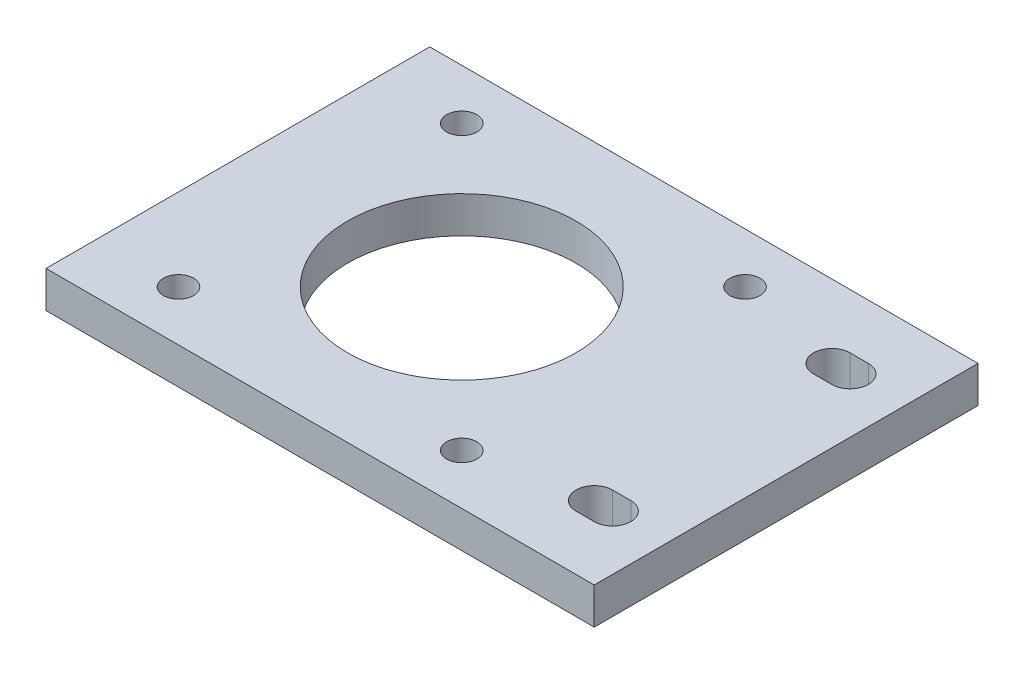
ISO-10303-21;
HEADER;
FILE_DESCRIPTION(('STEP AP214'),'2;1');
FILE_NAME('part.step','',(''),(''),'','','');
FILE_SCHEMA(('AUTOMOTIVE_DESIGN { 1 0 10303 214 1 1 1 1 }'));
ENDSEC;
DATA;
#1=APPLICATION_CONTEXT('core data for automotive mechanical design processes');
#2=APPLICATION_PROTOCOL_DEFINITION('international standard','automotive_design',2000,#1);
#3=PRODUCT_CONTEXT('',#1,'mechanical');
#4=PRODUCT('Part','Part','',(#3));
#5=PRODUCT_RELATED_PRODUCT_CATEGORY('part','',(#4));
#6=PRODUCT_DEFINITION_FORMATION('','',#4);
#7=PRODUCT_DEFINITION_CONTEXT('part definition',#1,'design');
#8=PRODUCT_DEFINITION('design','',#6,#7);
#9=PRODUCT_DEFINITION_SHAPE('','',#8);
#10=(LENGTH_UNIT() NAMED_UNIT(*) SI_UNIT(.MILLI.,.METRE.));
#11=(NAMED_UNIT(*) PLANE_ANGLE_UNIT() SI_UNIT($,.RADIAN.));
#12=(NAMED_UNIT(*) SI_UNIT($,.STERADIAN.) SOLID_ANGLE_UNIT());
#13=UNCERTAINTY_MEASURE_WITH_UNIT(LENGTH_MEASURE(1.E-05),#10,'distance_accuracy_value','');
#14=(GEOMETRIC_REPRESENTATION_CONTEXT(3) GLOBAL_UNCERTAINTY_ASSIGNED_CONTEXT((#13)) GLOBAL_UNIT_ASSIGNED_CONTEXT((#10,
#11,#12)) REPRESENTATION_CONTEXT('',''));
#15=CARTESIAN_POINT('',(0.,0.,0.));
#16=DIRECTION('',(0.,0.,1.));
#17=DIRECTION('',(1.,0.,0.));
#18=AXIS2_PLACEMENT_3D('',#15,#16,#17);
#19=CARTESIAN_POINT('',(0.,4.,0.));
#20=DIRECTION('',(0.,1.,0.));
#21=DIRECTION('',(0.,0.,1.));
#22=AXIS2_PLACEMENT_3D('',#19,#20,#21);
#23=PLANE('',#22);
#24=CARTESIAN_POINT('',(2.24787364877131,4.,32.6029842915746));
#25=DIRECTION('',(0.,1.,0.));
#26=DIRECTION('',(0.,0.,1.));
#27=AXIS2_PLACEMENT_3D('',#24,#25,#26);
#28=CIRCLE('',#27,1.65);
#29=CARTESIAN_POINT('',(2.24787364877131,4.,34.2529842915746));
#30=VERTEX_POINT('',#29);
#31=EDGE_CURVE('E377',#30,#30,#28,.T.);
#32=ORIENTED_EDGE('',*,*,#31,.F.);
#33=EDGE_LOOP('',(#32));
#34=FACE_BOUND('',#33,.T.);
#35=CARTESIAN_POINT('',(2.24787364877131,4.,1.60298429157464));
#36=DIRECTION('',(0.,1.,0.));
#37=DIRECTION('',(0.,0.,1.));
#38=AXIS2_PLACEMENT_3D('',#35,#36,#37);
#39=CIRCLE('',#38,1.65);
#40=CARTESIAN_POINT('',(2.24787364877131,4.,3.25298429157464));
#41=VERTEX_POINT('',#40);
#42=EDGE_CURVE('E393',#41,#41,#39,.T.);
#43=ORIENTED_EDGE('',*,*,#42,.F.);
#44=EDGE_LOOP('',(#43));
#45=FACE_BOUND('',#44,.T.);
#46=DIRECTION('',(1.,0.,0.));
#47=VECTOR('',#46,1.);
#48=CARTESIAN_POINT('',(45.2478736487713,4.,32.1029842915746));
#49=LINE('',#48,#47);
#50=CARTESIAN_POINT('',(45.2478736487713,4.,32.1029842915746));
#51=VERTEX_POINT('',#50);
#52=CARTESIAN_POINT('',(47.2478736487713,4.,32.1029842915746));
#53=VERTEX_POINT('',#52);
#54=EDGE_CURVE('E140',#51,#53,#49,.T.);
#55=ORIENTED_EDGE('',*,*,#54,.F.);
#56=CARTESIAN_POINT('',(45.2478736487713,4.,30.1029842915746));
#57=DIRECTION('',(0.,1.,0.));
#58=DIRECTION('',(0.,0.,-1.));
#59=AXIS2_PLACEMENT_3D('',#56,#57,#58);
#60=CIRCLE('',#59,2.);
#61=CARTESIAN_POINT('',(45.2478736487713,4.,28.1029842915746));
#62=VERTEX_POINT('',#61);
#63=EDGE_CURVE('E131',#62,#51,#60,.T.);
#64=ORIENTED_EDGE('',*,*,#63,.F.);
#65=DIRECTION('',(-1.,0.,0.));
#66=VECTOR('',#65,1.);
#67=CARTESIAN_POINT('',(45.2478736487713,4.,28.1029842915746));
#68=LINE('',#67,#66);
#69=CARTESIAN_POINT('',(47.2478736487713,4.,28.1029842915746));
#70=VERTEX_POINT('',#69);
#71=EDGE_CURVE('E158',#70,#62,#68,.T.);
#72=ORIENTED_EDGE('',*,*,#71,.F.);
#73=CARTESIAN_POINT('',(47.2478736487713,4.,30.1029842915746));
#74=DIRECTION('',(0.,1.,0.));
#75=DIRECTION('',(0.,0.,-1.));
#76=AXIS2_PLACEMENT_3D('',#73,#74,#75);
#77=CIRCLE('',#76,2.);
#78=EDGE_CURVE('E154',#53,#70,#77,.T.);
#79=ORIENTED_EDGE('',*,*,#78,.F.);
#80=EDGE_LOOP('',(#55,#64,#72,#79));
#81=FACE_BOUND('',#80,.T.);
#82=DIRECTION('',(1.,0.,0.));
#83=VECTOR('',#82,1.);
#84=CARTESIAN_POINT('',(45.2478736487713,4.,6.10298429157464));
#85=LINE('',#84,#83);
#86=CARTESIAN_POINT('',(45.2478736487713,4.,6.10298429157464));
#87=VERTEX_POINT('',#86);
#88=CARTESIAN_POINT('',(47.2478736487713,4.,6.10298429157464));
#89=VERTEX_POINT('',#88);
#90=EDGE_CURVE('E185',#87,#89,#85,.T.);
#91=ORIENTED_EDGE('',*,*,#90,.F.);
#92=CARTESIAN_POINT('',(45.2478736487713,4.,4.10298429157464));
#93=DIRECTION('',(0.,1.,0.));
#94=DIRECTION('',(0.,0.,1.));
#95=AXIS2_PLACEMENT_3D('',#92,#93,#94);
#96=CIRCLE('',#95,2.);
#97=CARTESIAN_POINT('',(45.2478736487713,4.,2.10298429157464));
#98=VERTEX_POINT('',#97);
#99=EDGE_CURVE('E182',#98,#87,#96,.T.);
#100=ORIENTED_EDGE('',*,*,#99,.F.);
#101=DIRECTION('',(-1.,0.,0.));
#102=VECTOR('',#101,1.);
#103=CARTESIAN_POINT('',(45.2478736487713,4.,2.10298429157464));
#104=LINE('',#103,#102);
#105=CARTESIAN_POINT('',(47.2478736487713,4.,2.10298429157464));
#106=VERTEX_POINT('',#105);
#107=EDGE_CURVE('E193',#106,#98,#104,.T.);
#108=ORIENTED_EDGE('',*,*,#107,.F.);
#109=CARTESIAN_POINT('',(47.2478736487713,4.,4.10298429157464));
#110=DIRECTION('',(0.,1.,0.));
#111=DIRECTION('',(0.,0.,1.));
#112=AXIS2_PLACEMENT_3D('',#109,#110,#111);
#113=CIRCLE('',#112,2.);
#114=EDGE_CURVE('E189',#89,#106,#113,.T.);
#115=ORIENTED_EDGE('',*,*,#114,.F.);
#116=EDGE_LOOP('',(#91,#100,#108,#115));
#117=FACE_BOUND('',#116,.T.);
#118=DIRECTION('',(0.,0.,1.));
#119=VECTOR('',#118,1.);
#120=CARTESIAN_POINT('',(-6.75212635122869,4.,-3.89701570842536));
#121=LINE('',#120,#119);
#122=CARTESIAN_POINT('',(-6.75212635122869,4.,-3.89701570842536));
#123=VERTEX_POINT('',#122);
#124=CARTESIAN_POINT('',(-6.75212635122869,4.,38.1029842915746));
#125=VERTEX_POINT('',#124);
#126=EDGE_CURVE('E225',#123,#125,#121,.T.);
#127=ORIENTED_EDGE('',*,*,#126,.T.);
#128=DIRECTION('',(1.,0.,0.));
#129=VECTOR('',#128,1.);
#130=CARTESIAN_POINT('',(-6.75212635122869,4.,38.1029842915746));
#131=LINE('',#130,#129);
#132=CARTESIAN_POINT('',(53.2478736487713,4.,38.1029842915746));
#133=VERTEX_POINT('',#132);
#134=EDGE_CURVE('E229',#125,#133,#131,.T.);
#135=ORIENTED_EDGE('',*,*,#134,.T.);
#136=DIRECTION('',(0.,0.,-1.));
#137=VECTOR('',#136,1.);
#138=CARTESIAN_POINT('',(53.2478736487713,4.,-3.89701570842536));
#139=LINE('',#138,#137);
#140=CARTESIAN_POINT('',(53.2478736487713,4.,-3.89701570842536));
#141=VERTEX_POINT('',#140);
#142=EDGE_CURVE('E233',#133,#141,#139,.T.);
#143=ORIENTED_EDGE('',*,*,#142,.T.);
#144=DIRECTION('',(-1.,0.,0.));
#145=VECTOR('',#144,1.);
#146=CARTESIAN_POINT('',(-6.75212635122869,4.,-3.89701570842536));
#147=LINE('',#146,#145);
#148=EDGE_CURVE('E236',#141,#123,#147,.T.);
#149=ORIENTED_EDGE('',*,*,#148,.T.);
#150=EDGE_LOOP('',(#127,#135,#143,#149));
#151=FACE_BOUND('',#150,.T.);
#152=CARTESIAN_POINT('',(33.2478736487713,4.,1.60298429157464));
#153=DIRECTION('',(0.,1.,0.));
#154=DIRECTION('',(0.,0.,1.));
#155=AXIS2_PLACEMENT_3D('',#152,#153,#154);
#156=CIRCLE('',#155,1.65);
#157=CARTESIAN_POINT('',(33.2478736487713,4.,3.25298429157464));
#158=VERTEX_POINT('',#157);
#159=EDGE_CURVE('E166',#158,#158,#156,.T.);
#160=ORIENTED_EDGE('',*,*,#159,.F.);
#161=EDGE_LOOP('',(#160));
#162=FACE_BOUND('',#161,.T.);
#163=CARTESIAN_POINT('',(33.2478736487713,4.,32.6029842915746));
#164=DIRECTION('',(0.,1.,0.));
#165=DIRECTION('',(0.,0.,1.));
#166=AXIS2_PLACEMENT_3D('',#163,#164,#165);
#167=CIRCLE('',#166,1.65);
#168=CARTESIAN_POINT('',(33.2478736487713,4.,34.2529842915746));
#169=VERTEX_POINT('',#168);
#170=EDGE_CURVE('E385',#169,#169,#167,.T.);
#171=ORIENTED_EDGE('',*,*,#170,.F.);
#172=EDGE_LOOP('',(#171));
#173=FACE_BOUND('',#172,.T.);
#174=CARTESIAN_POINT('',(17.7478736487713,4.,17.1029842915746));
#175=DIRECTION('',(0.,1.,0.));
#176=DIRECTION('',(0.,0.,1.));
#177=AXIS2_PLACEMENT_3D('',#174,#175,#176);
#178=CIRCLE('',#177,12.5);
#179=CARTESIAN_POINT('',(17.7478736487713,4.,29.6029842915746));
#180=VERTEX_POINT('',#179);
#181=EDGE_CURVE('E366',#180,#180,#178,.T.);
#182=ORIENTED_EDGE('',*,*,#181,.F.);
#183=EDGE_LOOP('',(#182));
#184=FACE_BOUND('',#183,.T.);
#185=ADVANCED_FACE('F41',(#34,#45,#81,#117,#151,#162,#173,#184),#23,.T.);
#186=CARTESIAN_POINT('',(0.,0.,0.));
#187=DIRECTION('',(0.,1.,0.));
#188=DIRECTION('',(0.,0.,1.));
#189=AXIS2_PLACEMENT_3D('',#186,#187,#188);
#190=PLANE('',#189);
#191=CARTESIAN_POINT('',(45.2478736487713,0.,4.10298429157464));
#192=DIRECTION('',(0.,1.,0.));
#193=DIRECTION('',(0.,0.,1.));
#194=AXIS2_PLACEMENT_3D('',#191,#192,#193);
#195=CIRCLE('',#194,2.);
#196=CARTESIAN_POINT('',(45.2478736487713,0.,2.10298429157464));
#197=VERTEX_POINT('',#196);
#198=CARTESIAN_POINT('',(45.2478736487713,0.,6.10298429157464));
#199=VERTEX_POINT('',#198);
#200=EDGE_CURVE('E149',#197,#199,#195,.T.);
#201=ORIENTED_EDGE('',*,*,#200,.T.);
#202=DIRECTION('',(1.,0.,0.));
#203=VECTOR('',#202,1.);
#204=CARTESIAN_POINT('',(45.2478736487713,0.,6.10298429157464));
#205=LINE('',#204,#203);
#206=CARTESIAN_POINT('',(47.2478736487713,0.,6.10298429157464));
#207=VERTEX_POINT('',#206);
#208=EDGE_CURVE('E200',#199,#207,#205,.T.);
#209=ORIENTED_EDGE('',*,*,#208,.T.);
#210=CARTESIAN_POINT('',(47.2478736487713,0.,4.10298429157464));
#211=DIRECTION('',(0.,1.,0.));
#212=DIRECTION('',(0.,0.,1.));
#213=AXIS2_PLACEMENT_3D('',#210,#211,#212);
#214=CIRCLE('',#213,2.);
#215=CARTESIAN_POINT('',(47.2478736487713,0.,2.10298429157464));
#216=VERTEX_POINT('',#215);
#217=EDGE_CURVE('E204',#207,#216,#214,.T.);
#218=ORIENTED_EDGE('',*,*,#217,.T.);
#219=DIRECTION('',(-1.,0.,0.));
#220=VECTOR('',#219,1.);
#221=CARTESIAN_POINT('',(45.2478736487713,0.,2.10298429157464));
#222=LINE('',#221,#220);
#223=EDGE_CURVE('E186',#216,#197,#222,.T.);
#224=ORIENTED_EDGE('',*,*,#223,.T.);
#225=EDGE_LOOP('',(#201,#209,#218,#224));
#226=FACE_BOUND('',#225,.T.);
#227=DIRECTION('',(0.,0.,1.));
#228=VECTOR('',#227,1.);
#229=CARTESIAN_POINT('',(-6.75212635122869,0.,-3.89701570842536));
#230=LINE('',#229,#228);
#231=CARTESIAN_POINT('',(-6.75212635122869,0.,-3.89701570842536));
#232=VERTEX_POINT('',#231);
#233=CARTESIAN_POINT('',(-6.75212635122869,0.,38.1029842915746));
#234=VERTEX_POINT('',#233);
#235=EDGE_CURVE('E224',#232,#234,#230,.T.);
#236=ORIENTED_EDGE('',*,*,#235,.F.);
#237=DIRECTION('',(-1.,0.,0.));
#238=VECTOR('',#237,1.);
#239=CARTESIAN_POINT('',(-6.75212635122869,0.,-3.89701570842536));
#240=LINE('',#239,#238);
#241=CARTESIAN_POINT('',(53.2478736487713,0.,-3.89701570842536));
#242=VERTEX_POINT('',#241);
#243=EDGE_CURVE('E230',#242,#232,#240,.T.);
#244=ORIENTED_EDGE('',*,*,#243,.F.);
#245=DIRECTION('',(0.,0.,-1.));
#246=VECTOR('',#245,1.);
#247=CARTESIAN_POINT('',(53.2478736487713,0.,-3.89701570842536));
#248=LINE('',#247,#246);
#249=CARTESIAN_POINT('',(53.2478736487713,0.,38.1029842915746));
#250=VERTEX_POINT('',#249);
#251=EDGE_CURVE('E246',#250,#242,#248,.T.);
#252=ORIENTED_EDGE('',*,*,#251,.F.);
#253=DIRECTION('',(1.,0.,0.));
#254=VECTOR('',#253,1.);
#255=CARTESIAN_POINT('',(-6.75212635122869,0.,38.1029842915746));
#256=LINE('',#255,#254);
#257=EDGE_CURVE('E243',#234,#250,#256,.T.);
#258=ORIENTED_EDGE('',*,*,#257,.F.);
#259=EDGE_LOOP('',(#236,#244,#252,#258));
#260=FACE_BOUND('',#259,.T.);
#261=CARTESIAN_POINT('',(45.2478736487713,0.,30.1029842915746));
#262=DIRECTION('',(0.,1.,0.));
#263=DIRECTION('',(0.,0.,-1.));
#264=AXIS2_PLACEMENT_3D('',#261,#262,#263);
#265=CIRCLE('',#264,2.);
#266=CARTESIAN_POINT('',(45.2478736487713,0.,28.1029842915746));
#267=VERTEX_POINT('',#266);
#268=CARTESIAN_POINT('',(45.2478736487713,0.,32.1029842915746));
#269=VERTEX_POINT('',#268);
#270=EDGE_CURVE('E65',#267,#269,#265,.T.);
#271=ORIENTED_EDGE('',*,*,#270,.T.);
#272=DIRECTION('',(1.,0.,0.));
#273=VECTOR('',#272,1.);
#274=CARTESIAN_POINT('',(45.2478736487713,0.,32.1029842915746));
#275=LINE('',#274,#273);
#276=CARTESIAN_POINT('',(47.2478736487713,0.,32.1029842915746));
#277=VERTEX_POINT('',#276);
#278=EDGE_CURVE('E147',#269,#277,#275,.T.);
#279=ORIENTED_EDGE('',*,*,#278,.T.);
#280=CARTESIAN_POINT('',(47.2478736487713,0.,30.1029842915746));
#281=DIRECTION('',(0.,1.,0.));
#282=DIRECTION('',(0.,0.,-1.));
#283=AXIS2_PLACEMENT_3D('',#280,#281,#282);
#284=CIRCLE('',#283,2.);
#285=CARTESIAN_POINT('',(47.2478736487713,0.,28.1029842915746));
#286=VERTEX_POINT('',#285);
#287=EDGE_CURVE('E169',#277,#286,#284,.T.);
#288=ORIENTED_EDGE('',*,*,#287,.T.);
#289=DIRECTION('',(-1.,0.,0.));
#290=VECTOR('',#289,1.);
#291=CARTESIAN_POINT('',(45.2478736487713,0.,28.1029842915746));
#292=LINE('',#291,#290);
#293=EDGE_CURVE('E141',#286,#267,#292,.T.);
#294=ORIENTED_EDGE('',*,*,#293,.T.);
#295=EDGE_LOOP('',(#271,#279,#288,#294));
#296=FACE_BOUND('',#295,.T.);
#297=CARTESIAN_POINT('',(33.2478736487713,0.,1.60298429157464));
#298=DIRECTION('',(0.,1.,0.));
#299=DIRECTION('',(0.,0.,1.));
#300=AXIS2_PLACEMENT_3D('',#297,#298,#299);
#301=CIRCLE('',#300,1.65);
#302=CARTESIAN_POINT('',(33.2478736487713,0.,3.25298429157464));
#303=VERTEX_POINT('',#302);
#304=EDGE_CURVE('E397',#303,#303,#301,.T.);
#305=ORIENTED_EDGE('',*,*,#304,.T.);
#306=EDGE_LOOP('',(#305));
#307=FACE_BOUND('',#306,.T.);
#308=CARTESIAN_POINT('',(2.24787364877131,0.,1.60298429157464));
#309=DIRECTION('',(0.,1.,0.));
#310=DIRECTION('',(0.,0.,1.));
#311=AXIS2_PLACEMENT_3D('',#308,#309,#310);
#312=CIRCLE('',#311,1.65);
#313=CARTESIAN_POINT('',(2.24787364877131,0.,3.25298429157464));
#314=VERTEX_POINT('',#313);
#315=EDGE_CURVE('E389',#314,#314,#312,.T.);
#316=ORIENTED_EDGE('',*,*,#315,.T.);
#317=EDGE_LOOP('',(#316));
#318=FACE_BOUND('',#317,.T.);
#319=CARTESIAN_POINT('',(33.2478736487713,0.,32.6029842915746));
#320=DIRECTION('',(0.,1.,0.));
#321=DIRECTION('',(0.,0.,1.));
#322=AXIS2_PLACEMENT_3D('',#319,#320,#321);
#323=CIRCLE('',#322,1.65);
#324=CARTESIAN_POINT('',(33.2478736487713,0.,34.2529842915746));
#325=VERTEX_POINT('',#324);
#326=EDGE_CURVE('E381',#325,#325,#323,.T.);
#327=ORIENTED_EDGE('',*,*,#326,.T.);
#328=EDGE_LOOP('',(#327));
#329=FACE_BOUND('',#328,.T.);
#330=CARTESIAN_POINT('',(2.24787364877131,0.,32.6029842915746));
#331=DIRECTION('',(0.,1.,0.));
#332=DIRECTION('',(0.,0.,1.));
#333=AXIS2_PLACEMENT_3D('',#330,#331,#332);
#334=CIRCLE('',#333,1.65);
#335=CARTESIAN_POINT('',(2.24787364877131,0.,34.2529842915746));
#336=VERTEX_POINT('',#335);
#337=EDGE_CURVE('E374',#336,#336,#334,.T.);
#338=ORIENTED_EDGE('',*,*,#337,.T.);
#339=EDGE_LOOP('',(#338));
#340=FACE_BOUND('',#339,.T.);
#341=CARTESIAN_POINT('',(17.7478736487713,0.,17.1029842915746));
#342=DIRECTION('',(0.,1.,0.));
#343=DIRECTION('',(0.,0.,1.));
#344=AXIS2_PLACEMENT_3D('',#341,#342,#343);
#345=CIRCLE('',#344,12.5);
#346=CARTESIAN_POINT('',(17.7478736487713,0.,29.6029842915746));
#347=VERTEX_POINT('',#346);
#348=EDGE_CURVE('E369',#347,#347,#345,.T.);
#349=ORIENTED_EDGE('',*,*,#348,.T.);
#350=EDGE_LOOP('',(#349));
#351=FACE_BOUND('',#350,.T.);
#352=ADVANCED_FACE('F269',(#226,#260,#296,#307,#318,#329,#340,#351),#190,.F.);
#353=CARTESIAN_POINT('',(-6.75212635122869,4.,-3.89701570842536));
#354=DIRECTION('',(1.,0.,0.));
#355=DIRECTION('',(0.,0.,-1.));
#356=AXIS2_PLACEMENT_3D('',#353,#354,#355);
#357=PLANE('',#356);
#358=ORIENTED_EDGE('',*,*,#235,.T.);
#359=DIRECTION('',(0.,-1.,0.));
#360=VECTOR('',#359,1.);
#361=CARTESIAN_POINT('',(-6.75212635122869,4.,38.1029842915746));
#362=LINE('',#361,#360);
#363=EDGE_CURVE('E11',#125,#234,#362,.T.);
#364=ORIENTED_EDGE('',*,*,#363,.F.);
#365=ORIENTED_EDGE('',*,*,#126,.F.);
#366=DIRECTION('',(0.,-1.,0.));
#367=VECTOR('',#366,1.);
#368=CARTESIAN_POINT('',(-6.75212635122869,4.,-3.89701570842536));
#369=LINE('',#368,#367);
#370=EDGE_CURVE('E239',#123,#232,#369,.T.);
#371=ORIENTED_EDGE('',*,*,#370,.T.);
#372=EDGE_LOOP('',(#358,#364,#365,#371));
#373=FACE_BOUND('',#372,.T.);
#374=ADVANCED_FACE('F43',(#373),#357,.F.);
#375=CARTESIAN_POINT('',(-6.75212635122869,4.,38.1029842915746));
#376=DIRECTION('',(0.,0.,-1.));
#377=DIRECTION('',(-1.,0.,0.));
#378=AXIS2_PLACEMENT_3D('',#375,#376,#377);
#379=PLANE('',#378);
#380=ORIENTED_EDGE('',*,*,#257,.T.);
#381=DIRECTION('',(0.,-1.,0.));
#382=VECTOR('',#381,1.);
#383=CARTESIAN_POINT('',(53.2478736487713,4.,38.1029842915746));
#384=LINE('',#383,#382);
#385=EDGE_CURVE('E50',#133,#250,#384,.T.);
#386=ORIENTED_EDGE('',*,*,#385,.F.);
#387=ORIENTED_EDGE('',*,*,#134,.F.);
#388=ORIENTED_EDGE('',*,*,#363,.T.);
#389=EDGE_LOOP('',(#380,#386,#387,#388));
#390=FACE_BOUND('',#389,.T.);
#391=ADVANCED_FACE('F280',(#390),#379,.F.);
#392=CARTESIAN_POINT('',(53.2478736487713,4.,-3.89701570842536));
#393=DIRECTION('',(-1.,0.,0.));
#394=DIRECTION('',(0.,0.,1.));
#395=AXIS2_PLACEMENT_3D('',#392,#393,#394);
#396=PLANE('',#395);
#397=ORIENTED_EDGE('',*,*,#251,.T.);
#398=DIRECTION('',(0.,-1.,0.));
#399=VECTOR('',#398,1.);
#400=CARTESIAN_POINT('',(53.2478736487713,4.,-3.89701570842536));
#401=LINE('',#400,#399);
#402=EDGE_CURVE('E254',#141,#242,#401,.T.);
#403=ORIENTED_EDGE('',*,*,#402,.F.);
#404=ORIENTED_EDGE('',*,*,#142,.F.);
#405=ORIENTED_EDGE('',*,*,#385,.T.);
#406=EDGE_LOOP('',(#397,#403,#404,#405));
#407=FACE_BOUND('',#406,.T.);
#408=ADVANCED_FACE('F263',(#407),#396,.F.);
#409=CARTESIAN_POINT('',(-6.75212635122869,4.,-3.89701570842536));
#410=DIRECTION('',(0.,0.,1.));
#411=DIRECTION('',(1.,0.,0.));
#412=AXIS2_PLACEMENT_3D('',#409,#410,#411);
#413=PLANE('',#412);
#414=ORIENTED_EDGE('',*,*,#243,.T.);
#415=ORIENTED_EDGE('',*,*,#370,.F.);
#416=ORIENTED_EDGE('',*,*,#148,.F.);
#417=ORIENTED_EDGE('',*,*,#402,.T.);
#418=EDGE_LOOP('',(#414,#415,#416,#417));
#419=FACE_BOUND('',#418,.T.);
#420=ADVANCED_FACE('F273',(#419),#413,.F.);
#421=CARTESIAN_POINT('',(45.2478736487713,4.,4.10298429157464));
#422=DIRECTION('',(0.,-1.,0.));
#423=DIRECTION('',(0.,0.,-1.));
#424=AXIS2_PLACEMENT_3D('',#421,#422,#423);
#425=CYLINDRICAL_SURFACE('',#424,2.);
#426=ORIENTED_EDGE('',*,*,#200,.F.);
#427=DIRECTION('',(0.,-1.,0.));
#428=VECTOR('',#427,1.);
#429=CARTESIAN_POINT('',(45.2478736487713,4.,2.10298429157464));
#430=LINE('',#429,#428);
#431=EDGE_CURVE('E196',#98,#197,#430,.T.);
#432=ORIENTED_EDGE('',*,*,#431,.F.);
#433=ORIENTED_EDGE('',*,*,#99,.T.);
#434=DIRECTION('',(0.,-1.,0.));
#435=VECTOR('',#434,1.);
#436=CARTESIAN_POINT('',(45.2478736487713,4.,6.10298429157464));
#437=LINE('',#436,#435);
#438=EDGE_CURVE('E220',#87,#199,#437,.T.);
#439=ORIENTED_EDGE('',*,*,#438,.T.);
#440=EDGE_LOOP('',(#426,#432,#433,#439));
#441=FACE_BOUND('',#440,.T.);
#442=ADVANCED_FACE('F298',(#441),#425,.F.);
#443=CARTESIAN_POINT('',(45.2478736487713,4.,6.10298429157464));
#444=DIRECTION('',(0.,0.,-1.));
#445=DIRECTION('',(-1.,0.,0.));
#446=AXIS2_PLACEMENT_3D('',#443,#444,#445);
#447=PLANE('',#446);
#448=ORIENTED_EDGE('',*,*,#208,.F.);
#449=ORIENTED_EDGE('',*,*,#438,.F.);
#450=ORIENTED_EDGE('',*,*,#90,.T.);
#451=DIRECTION('',(0.,-1.,0.));
#452=VECTOR('',#451,1.);
#453=CARTESIAN_POINT('',(47.2478736487713,4.,6.10298429157464));
#454=LINE('',#453,#452);
#455=EDGE_CURVE('E217',#89,#207,#454,.T.);
#456=ORIENTED_EDGE('',*,*,#455,.T.);
#457=EDGE_LOOP('',(#448,#449,#450,#456));
#458=FACE_BOUND('',#457,.T.);
#459=ADVANCED_FACE('F305',(#458),#447,.T.);
#460=CARTESIAN_POINT('',(47.2478736487713,4.,4.10298429157464));
#461=DIRECTION('',(0.,-1.,0.));
#462=DIRECTION('',(0.,0.,-1.));
#463=AXIS2_PLACEMENT_3D('',#460,#461,#462);
#464=CYLINDRICAL_SURFACE('',#463,2.);
#465=ORIENTED_EDGE('',*,*,#217,.F.);
#466=ORIENTED_EDGE('',*,*,#455,.F.);
#467=ORIENTED_EDGE('',*,*,#114,.T.);
#468=DIRECTION('',(0.,-1.,0.));
#469=VECTOR('',#468,1.);
#470=CARTESIAN_POINT('',(47.2478736487713,4.,2.10298429157464));
#471=LINE('',#470,#469);
#472=EDGE_CURVE('E214',#106,#216,#471,.T.);
#473=ORIENTED_EDGE('',*,*,#472,.T.);
#474=EDGE_LOOP('',(#465,#466,#467,#473));
#475=FACE_BOUND('',#474,.T.);
#476=ADVANCED_FACE('F310',(#475),#464,.F.);
#477=CARTESIAN_POINT('',(45.2478736487713,4.,2.10298429157464));
#478=DIRECTION('',(0.,0.,1.));
#479=DIRECTION('',(1.,0.,0.));
#480=AXIS2_PLACEMENT_3D('',#477,#478,#479);
#481=PLANE('',#480);
#482=ORIENTED_EDGE('',*,*,#223,.F.);
#483=ORIENTED_EDGE('',*,*,#472,.F.);
#484=ORIENTED_EDGE('',*,*,#107,.T.);
#485=ORIENTED_EDGE('',*,*,#431,.T.);
#486=EDGE_LOOP('',(#482,#483,#484,#485));
#487=FACE_BOUND('',#486,.T.);
#488=ADVANCED_FACE('F317',(#487),#481,.T.);
#489=CARTESIAN_POINT('',(45.2478736487713,4.,30.1029842915746));
#490=DIRECTION('',(0.,-1.,0.));
#491=DIRECTION('',(0.,0.,-1.));
#492=AXIS2_PLACEMENT_3D('',#489,#490,#491);
#493=CYLINDRICAL_SURFACE('',#492,2.);
#494=ORIENTED_EDGE('',*,*,#270,.F.);
#495=DIRECTION('',(0.,-1.,0.));
#496=VECTOR('',#495,1.);
#497=CARTESIAN_POINT('',(45.2478736487713,4.,28.1029842915746));
#498=LINE('',#497,#496);
#499=EDGE_CURVE('E135',#62,#267,#498,.T.);
#500=ORIENTED_EDGE('',*,*,#499,.F.);
#501=ORIENTED_EDGE('',*,*,#63,.T.);
#502=DIRECTION('',(0.,-1.,0.));
#503=VECTOR('',#502,1.);
#504=CARTESIAN_POINT('',(45.2478736487713,4.,32.1029842915746));
#505=LINE('',#504,#503);
#506=EDGE_CURVE('E134',#51,#269,#505,.T.);
#507=ORIENTED_EDGE('',*,*,#506,.T.);
#508=EDGE_LOOP('',(#494,#500,#501,#507));
#509=FACE_BOUND('',#508,.T.);
#510=ADVANCED_FACE('F133',(#509),#493,.F.);
#511=CARTESIAN_POINT('',(45.2478736487713,4.,32.1029842915746));
#512=DIRECTION('',(0.,0.,-1.));
#513=DIRECTION('',(-1.,0.,0.));
#514=AXIS2_PLACEMENT_3D('',#511,#512,#513);
#515=PLANE('',#514);
#516=ORIENTED_EDGE('',*,*,#278,.F.);
#517=ORIENTED_EDGE('',*,*,#506,.F.);
#518=ORIENTED_EDGE('',*,*,#54,.T.);
#519=DIRECTION('',(0.,-1.,0.));
#520=VECTOR('',#519,1.);
#521=CARTESIAN_POINT('',(47.2478736487713,4.,32.1029842915746));
#522=LINE('',#521,#520);
#523=EDGE_CURVE('E150',#53,#277,#522,.T.);
#524=ORIENTED_EDGE('',*,*,#523,.T.);
#525=EDGE_LOOP('',(#516,#517,#518,#524));
#526=FACE_BOUND('',#525,.T.);
#527=ADVANCED_FACE('F144',(#526),#515,.T.);
#528=CARTESIAN_POINT('',(47.2478736487713,4.,30.1029842915746));
#529=DIRECTION('',(0.,-1.,0.));
#530=DIRECTION('',(0.,0.,-1.));
#531=AXIS2_PLACEMENT_3D('',#528,#529,#530);
#532=CYLINDRICAL_SURFACE('',#531,2.);
#533=ORIENTED_EDGE('',*,*,#287,.F.);
#534=ORIENTED_EDGE('',*,*,#523,.F.);
#535=ORIENTED_EDGE('',*,*,#78,.T.);
#536=DIRECTION('',(0.,-1.,0.));
#537=VECTOR('',#536,1.);
#538=CARTESIAN_POINT('',(47.2478736487713,4.,28.1029842915746));
#539=LINE('',#538,#537);
#540=EDGE_CURVE('E57',#70,#286,#539,.T.);
#541=ORIENTED_EDGE('',*,*,#540,.T.);
#542=EDGE_LOOP('',(#533,#534,#535,#541));
#543=FACE_BOUND('',#542,.T.);
#544=ADVANCED_FACE('F335',(#543),#532,.F.);
#545=CARTESIAN_POINT('',(45.2478736487713,4.,28.1029842915746));
#546=DIRECTION('',(0.,0.,1.));
#547=DIRECTION('',(1.,0.,0.));
#548=AXIS2_PLACEMENT_3D('',#545,#546,#547);
#549=PLANE('',#548);
#550=ORIENTED_EDGE('',*,*,#293,.F.);
#551=ORIENTED_EDGE('',*,*,#540,.F.);
#552=ORIENTED_EDGE('',*,*,#71,.T.);
#553=ORIENTED_EDGE('',*,*,#499,.T.);
#554=EDGE_LOOP('',(#550,#551,#552,#553));
#555=FACE_BOUND('',#554,.T.);
#556=ADVANCED_FACE('F338',(#555),#549,.T.);
#557=CARTESIAN_POINT('',(33.2478736487713,4.,1.60298429157464));
#558=DIRECTION('',(0.,-1.,0.));
#559=DIRECTION('',(0.,0.,-1.));
#560=AXIS2_PLACEMENT_3D('',#557,#558,#559);
#561=CYLINDRICAL_SURFACE('',#560,1.65);
#562=ORIENTED_EDGE('',*,*,#159,.T.);
#563=EDGE_LOOP('',(#562));
#564=FACE_BOUND('',#563,.T.);
#565=ORIENTED_EDGE('',*,*,#304,.F.);
#566=EDGE_LOOP('',(#565));
#567=FACE_BOUND('',#566,.T.);
#568=ADVANCED_FACE('F342',(#564,#567),#561,.F.);
#569=CARTESIAN_POINT('',(2.24787364877131,4.,1.60298429157464));
#570=DIRECTION('',(0.,-1.,0.));
#571=DIRECTION('',(0.,0.,-1.));
#572=AXIS2_PLACEMENT_3D('',#569,#570,#571);
#573=CYLINDRICAL_SURFACE('',#572,1.65);
#574=ORIENTED_EDGE('',*,*,#42,.T.);
#575=EDGE_LOOP('',(#574));
#576=FACE_BOUND('',#575,.T.);
#577=ORIENTED_EDGE('',*,*,#315,.F.);
#578=EDGE_LOOP('',(#577));
#579=FACE_BOUND('',#578,.T.);
#580=ADVANCED_FACE('F345',(#576,#579),#573,.F.);
#581=CARTESIAN_POINT('',(33.2478736487713,4.,32.6029842915746));
#582=DIRECTION('',(0.,-1.,0.));
#583=DIRECTION('',(0.,0.,-1.));
#584=AXIS2_PLACEMENT_3D('',#581,#582,#583);
#585=CYLINDRICAL_SURFACE('',#584,1.65);
#586=ORIENTED_EDGE('',*,*,#170,.T.);
#587=EDGE_LOOP('',(#586));
#588=FACE_BOUND('',#587,.T.);
#589=ORIENTED_EDGE('',*,*,#326,.F.);
#590=EDGE_LOOP('',(#589));
#591=FACE_BOUND('',#590,.T.);
#592=ADVANCED_FACE('F349',(#588,#591),#585,.F.);
#593=CARTESIAN_POINT('',(2.24787364877131,4.,32.6029842915746));
#594=DIRECTION('',(0.,-1.,0.));
#595=DIRECTION('',(0.,0.,-1.));
#596=AXIS2_PLACEMENT_3D('',#593,#594,#595);
#597=CYLINDRICAL_SURFACE('',#596,1.65);
#598=ORIENTED_EDGE('',*,*,#31,.T.);
#599=EDGE_LOOP('',(#598));
#600=FACE_BOUND('',#599,.T.);
#601=ORIENTED_EDGE('',*,*,#337,.F.);
#602=EDGE_LOOP('',(#601));
#603=FACE_BOUND('',#602,.T.);
#604=ADVANCED_FACE('F353',(#600,#603),#597,.F.);
#605=CARTESIAN_POINT('',(17.7478736487713,4.,17.1029842915746));
#606=DIRECTION('',(0.,-1.,0.));
#607=DIRECTION('',(0.,0.,-1.));
#608=AXIS2_PLACEMENT_3D('',#605,#606,#607);
#609=CYLINDRICAL_SURFACE('',#608,12.5);
#610=ORIENTED_EDGE('',*,*,#181,.T.);
#611=EDGE_LOOP('',(#610));
#612=FACE_BOUND('',#611,.T.);
#613=ORIENTED_EDGE('',*,*,#348,.F.);
#614=EDGE_LOOP('',(#613));
#615=FACE_BOUND('',#614,.T.);
#616=ADVANCED_FACE('F357',(#612,#615),#609,.F.);
#617=CLOSED_SHELL('',(#185,#352,#374,#391,#408,#420,#442,#459,#476,#488,#510,#527,#544,#556,
#568,#580,#592,#604,#616));
#618=MANIFOLD_SOLID_BREP('B2',#617);
#619=ADVANCED_BREP_SHAPE_REPRESENTATION('',(#18,#618),#14);
#620=SHAPE_DEFINITION_REPRESENTATION(#9,#619);
ENDSEC;
END-ISO-10303-21;
